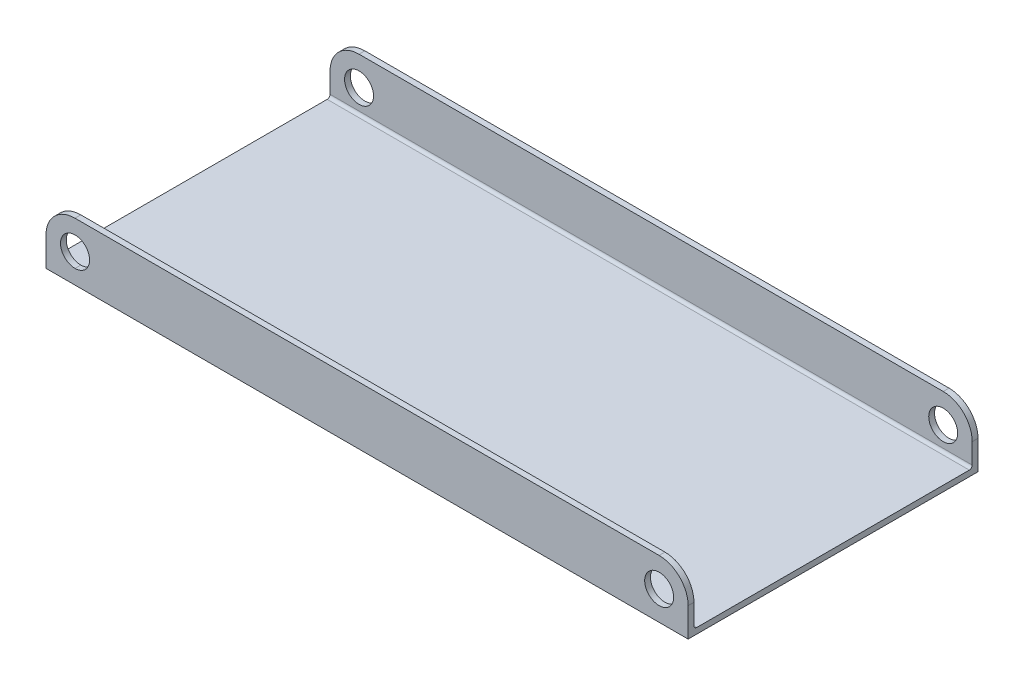
ISO-10303-21;
HEADER;
FILE_DESCRIPTION(('STEP AP214'),'2;1');
FILE_NAME('part.step','',(''),(''),'','','');
FILE_SCHEMA(('AUTOMOTIVE_DESIGN { 1 0 10303 214 1 1 1 1 }'));
ENDSEC;
DATA;
#1=APPLICATION_CONTEXT('core data for automotive mechanical design processes');
#2=APPLICATION_PROTOCOL_DEFINITION('international standard','automotive_design',2000,#1);
#3=PRODUCT_CONTEXT('',#1,'mechanical');
#4=PRODUCT('Part','Part','',(#3));
#5=PRODUCT_RELATED_PRODUCT_CATEGORY('part','',(#4));
#6=PRODUCT_DEFINITION_FORMATION('','',#4);
#7=PRODUCT_DEFINITION_CONTEXT('part definition',#1,'design');
#8=PRODUCT_DEFINITION('design','',#6,#7);
#9=PRODUCT_DEFINITION_SHAPE('','',#8);
#10=(LENGTH_UNIT() NAMED_UNIT(*) SI_UNIT(.MILLI.,.METRE.));
#11=(NAMED_UNIT(*) PLANE_ANGLE_UNIT() SI_UNIT($,.RADIAN.));
#12=(NAMED_UNIT(*) SI_UNIT($,.STERADIAN.) SOLID_ANGLE_UNIT());
#13=UNCERTAINTY_MEASURE_WITH_UNIT(LENGTH_MEASURE(1.E-05),#10,'distance_accuracy_value','');
#14=(GEOMETRIC_REPRESENTATION_CONTEXT(3) GLOBAL_UNCERTAINTY_ASSIGNED_CONTEXT((#13)) GLOBAL_UNIT_ASSIGNED_CONTEXT((#10,
#11,#12)) REPRESENTATION_CONTEXT('',''));
#15=CARTESIAN_POINT('',(0.,0.,0.));
#16=DIRECTION('',(0.,0.,1.));
#17=DIRECTION('',(1.,0.,0.));
#18=AXIS2_PLACEMENT_3D('',#15,#16,#17);
#19=CARTESIAN_POINT('',(0.,12.7,-1.27));
#20=DIRECTION('',(0.,0.,-1.));
#21=DIRECTION('',(-1.,0.,0.));
#22=AXIS2_PLACEMENT_3D('',#19,#20,#21);
#23=PLANE('',#22);
#24=CARTESIAN_POINT('',(6.35,6.35,-1.27));
#25=DIRECTION('',(0.,0.,-1.));
#26=DIRECTION('',(-1.,0.,0.));
#27=AXIS2_PLACEMENT_3D('',#24,#25,#26);
#28=CIRCLE('',#27,3.175);
#29=CARTESIAN_POINT('',(6.36182195991576,3.17502200932609,-1.27));
#30=VERTEX_POINT('',#29);
#31=CARTESIAN_POINT('',(6.36182195991576,9.52497799067391,-1.26999999999999));
#32=VERTEX_POINT('',#31);
#33=EDGE_CURVE('E58',#30,#32,#28,.T.);
#34=ORIENTED_EDGE('',*,*,#33,.F.);
#35=CARTESIAN_POINT('',(6.37364391983117,6.35,-1.26999999999999));
#36=DIRECTION('',(0.,0.,-1.));
#37=DIRECTION('',(-1.,0.,0.));
#38=AXIS2_PLACEMENT_3D('',#35,#36,#37);
#39=CIRCLE('',#38,3.175);
#40=EDGE_CURVE('E173',#32,#30,#39,.T.);
#41=ORIENTED_EDGE('',*,*,#40,.F.);
#42=EDGE_LOOP('',(#34,#41));
#43=FACE_BOUND('',#42,.T.);
#44=CARTESIAN_POINT('',(134.326923076923,6.34999999999998,-1.27));
#45=DIRECTION('',(0.,0.,-1.));
#46=DIRECTION('',(-1.,0.,0.));
#47=AXIS2_PLACEMENT_3D('',#44,#45,#46);
#48=CIRCLE('',#47,3.175);
#49=CARTESIAN_POINT('',(131.151923076923,6.34999999999998,-1.27));
#50=VERTEX_POINT('',#49);
#51=EDGE_CURVE('E162',#50,#50,#48,.T.);
#52=ORIENTED_EDGE('',*,*,#51,.F.);
#53=EDGE_LOOP('',(#52));
#54=FACE_BOUND('',#53,.T.);
#55=DIRECTION('',(0.,-1.,0.));
#56=VECTOR('',#55,1.);
#57=CARTESIAN_POINT('',(140.676923076923,12.7,-1.27));
#58=LINE('',#57,#56);
#59=CARTESIAN_POINT('',(140.676923076923,6.35,-1.27));
#60=VERTEX_POINT('',#59);
#61=CARTESIAN_POINT('',(140.676923076923,1.905,-1.27));
#62=VERTEX_POINT('',#61);
#63=EDGE_CURVE('E194',#60,#62,#58,.T.);
#64=ORIENTED_EDGE('',*,*,#63,.T.);
#65=DIRECTION('',(1.,0.,0.));
#66=VECTOR('',#65,1.);
#67=CARTESIAN_POINT('',(0.,1.905,-1.27));
#68=LINE('',#67,#66);
#69=CARTESIAN_POINT('',(0.,1.905,-1.27));
#70=VERTEX_POINT('',#69);
#71=EDGE_CURVE('E252',#62,#70,#68,.F.);
#72=ORIENTED_EDGE('',*,*,#71,.T.);
#73=DIRECTION('',(0.,-1.,0.));
#74=VECTOR('',#73,1.);
#75=CARTESIAN_POINT('',(0.,12.7,-1.27));
#76=LINE('',#75,#74);
#77=CARTESIAN_POINT('',(0.,6.35,-1.27));
#78=VERTEX_POINT('',#77);
#79=EDGE_CURVE('E208',#78,#70,#76,.T.);
#80=ORIENTED_EDGE('',*,*,#79,.F.);
#81=CARTESIAN_POINT('',(6.35,6.35,-1.27));
#82=DIRECTION('',(0.,0.,-1.));
#83=DIRECTION('',(-1.,0.,0.));
#84=AXIS2_PLACEMENT_3D('',#81,#82,#83);
#85=CIRCLE('',#84,6.35);
#86=CARTESIAN_POINT('',(6.35,12.7,-1.27));
#87=VERTEX_POINT('',#86);
#88=EDGE_CURVE('E219',#78,#87,#85,.T.);
#89=ORIENTED_EDGE('',*,*,#88,.T.);
#90=DIRECTION('',(1.,0.,0.));
#91=VECTOR('',#90,1.);
#92=CARTESIAN_POINT('',(0.,12.7,-1.27));
#93=LINE('',#92,#91);
#94=CARTESIAN_POINT('',(134.326923076923,12.7,-1.27));
#95=VERTEX_POINT('',#94);
#96=EDGE_CURVE('E187',#87,#95,#93,.T.);
#97=ORIENTED_EDGE('',*,*,#96,.T.);
#98=CARTESIAN_POINT('',(134.326923076923,6.35,-1.27));
#99=DIRECTION('',(0.,0.,-1.));
#100=DIRECTION('',(-1.,0.,0.));
#101=AXIS2_PLACEMENT_3D('',#98,#99,#100);
#102=CIRCLE('',#101,6.35);
#103=EDGE_CURVE('E217',#95,#60,#102,.T.);
#104=ORIENTED_EDGE('',*,*,#103,.T.);
#105=EDGE_LOOP('',(#64,#72,#80,#89,#97,#104));
#106=FACE_BOUND('',#105,.T.);
#107=ADVANCED_FACE('F43',(#43,#54,#106),#23,.T.);
#108=CARTESIAN_POINT('',(0.,12.7,0.));
#109=DIRECTION('',(-1.,0.,0.));
#110=DIRECTION('',(0.,0.,1.));
#111=AXIS2_PLACEMENT_3D('',#108,#109,#110);
#112=PLANE('',#111);
#113=DIRECTION('',(0.,-1.,0.));
#114=VECTOR('',#113,1.);
#115=CARTESIAN_POINT('',(0.,12.7,0.));
#116=LINE('',#115,#114);
#117=CARTESIAN_POINT('',(0.,6.35,0.));
#118=VERTEX_POINT('',#117);
#119=CARTESIAN_POINT('',(0.,0.,0.));
#120=VERTEX_POINT('',#119);
#121=EDGE_CURVE('E206',#118,#120,#116,.T.);
#122=ORIENTED_EDGE('',*,*,#121,.F.);
#123=DIRECTION('',(0.,0.,-1.));
#124=VECTOR('',#123,1.);
#125=CARTESIAN_POINT('',(0.,6.35,0.));
#126=LINE('',#125,#124);
#127=EDGE_CURVE('E214',#118,#78,#126,.T.);
#128=ORIENTED_EDGE('',*,*,#127,.T.);
#129=ORIENTED_EDGE('',*,*,#79,.T.);
#130=CARTESIAN_POINT('',(0.,1.905,-1.905));
#131=DIRECTION('',(-1.,0.,0.));
#132=DIRECTION('',(0.,0.,1.));
#133=AXIS2_PLACEMENT_3D('',#130,#131,#132);
#134=CIRCLE('',#133,0.635);
#135=CARTESIAN_POINT('',(0.,1.27,-1.905));
#136=VERTEX_POINT('',#135);
#137=EDGE_CURVE('E259',#70,#136,#134,.F.);
#138=ORIENTED_EDGE('',*,*,#137,.T.);
#139=DIRECTION('',(0.,0.,-1.));
#140=VECTOR('',#139,1.);
#141=CARTESIAN_POINT('',(0.,1.27,0.));
#142=LINE('',#141,#140);
#143=CARTESIAN_POINT('',(0.,1.27,-61.595));
#144=VERTEX_POINT('',#143);
#145=EDGE_CURVE('E176',#136,#144,#142,.T.);
#146=ORIENTED_EDGE('',*,*,#145,.T.);
#147=CARTESIAN_POINT('',(0.,1.905,-61.595));
#148=DIRECTION('',(-1.,0.,0.));
#149=DIRECTION('',(0.,0.,1.));
#150=AXIS2_PLACEMENT_3D('',#147,#148,#149);
#151=CIRCLE('',#150,0.635);
#152=CARTESIAN_POINT('',(0.,1.905,-62.23));
#153=VERTEX_POINT('',#152);
#154=EDGE_CURVE('E11',#144,#153,#151,.F.);
#155=ORIENTED_EDGE('',*,*,#154,.T.);
#156=DIRECTION('',(0.,-1.,0.));
#157=VECTOR('',#156,1.);
#158=CARTESIAN_POINT('',(0.,12.7,-62.23));
#159=LINE('',#158,#157);
#160=CARTESIAN_POINT('',(0.,6.35,-62.23));
#161=VERTEX_POINT('',#160);
#162=EDGE_CURVE('E174',#161,#153,#159,.T.);
#163=ORIENTED_EDGE('',*,*,#162,.F.);
#164=DIRECTION('',(0.,0.,-1.));
#165=VECTOR('',#164,1.);
#166=CARTESIAN_POINT('',(0.,6.35,0.));
#167=LINE('',#166,#165);
#168=CARTESIAN_POINT('',(0.,6.35,-63.5));
#169=VERTEX_POINT('',#168);
#170=EDGE_CURVE('E211',#161,#169,#167,.T.);
#171=ORIENTED_EDGE('',*,*,#170,.T.);
#172=DIRECTION('',(0.,-1.,0.));
#173=VECTOR('',#172,1.);
#174=CARTESIAN_POINT('',(0.,12.7,-63.5));
#175=LINE('',#174,#173);
#176=CARTESIAN_POINT('',(0.,0.,-63.5));
#177=VERTEX_POINT('',#176);
#178=EDGE_CURVE('E291',#169,#177,#175,.T.);
#179=ORIENTED_EDGE('',*,*,#178,.T.);
#180=DIRECTION('',(0.,0.,-1.));
#181=VECTOR('',#180,1.);
#182=CARTESIAN_POINT('',(0.,0.,0.));
#183=LINE('',#182,#181);
#184=EDGE_CURVE('E186',#120,#177,#183,.T.);
#185=ORIENTED_EDGE('',*,*,#184,.F.);
#186=EDGE_LOOP('',(#122,#128,#129,#138,#146,#155,#163,#171,#179,#185));
#187=FACE_BOUND('',#186,.T.);
#188=ADVANCED_FACE('F280',(#187),#112,.T.);
#189=CARTESIAN_POINT('',(0.,12.7,0.));
#190=DIRECTION('',(0.,0.,-1.));
#191=DIRECTION('',(-1.,0.,0.));
#192=AXIS2_PLACEMENT_3D('',#189,#190,#191);
#193=PLANE('',#192);
#194=CARTESIAN_POINT('',(134.326923076923,6.34999999999998,0.));
#195=DIRECTION('',(0.,0.,-1.));
#196=DIRECTION('',(-1.,0.,0.));
#197=AXIS2_PLACEMENT_3D('',#194,#195,#196);
#198=CIRCLE('',#197,3.175);
#199=CARTESIAN_POINT('',(131.151923076923,6.34999999999998,0.));
#200=VERTEX_POINT('',#199);
#201=EDGE_CURVE('E169',#200,#200,#198,.T.);
#202=ORIENTED_EDGE('',*,*,#201,.T.);
#203=EDGE_LOOP('',(#202));
#204=FACE_BOUND('',#203,.T.);
#205=CARTESIAN_POINT('',(6.37364391983117,6.35,0.));
#206=DIRECTION('',(0.,0.,1.));
#207=DIRECTION('',(1.,0.,0.));
#208=AXIS2_PLACEMENT_3D('',#205,#206,#207);
#209=CIRCLE('',#208,3.175);
#210=CARTESIAN_POINT('',(6.36182195991576,3.17502200932609,0.));
#211=VERTEX_POINT('',#210);
#212=CARTESIAN_POINT('',(6.36182195991576,9.52497799067391,0.));
#213=VERTEX_POINT('',#212);
#214=EDGE_CURVE('E168',#211,#213,#209,.T.);
#215=ORIENTED_EDGE('',*,*,#214,.F.);
#216=CARTESIAN_POINT('',(6.35,6.35,0.));
#217=DIRECTION('',(0.,0.,-1.));
#218=DIRECTION('',(-1.,0.,0.));
#219=AXIS2_PLACEMENT_3D('',#216,#217,#218);
#220=CIRCLE('',#219,3.175);
#221=EDGE_CURVE('E156',#211,#213,#220,.T.);
#222=ORIENTED_EDGE('',*,*,#221,.T.);
#223=EDGE_LOOP('',(#215,#222));
#224=FACE_BOUND('',#223,.T.);
#225=DIRECTION('',(1.,0.,0.));
#226=VECTOR('',#225,1.);
#227=CARTESIAN_POINT('',(0.,12.7,0.));
#228=LINE('',#227,#226);
#229=CARTESIAN_POINT('',(6.35,12.7,0.));
#230=VERTEX_POINT('',#229);
#231=CARTESIAN_POINT('',(134.326923076923,12.7,0.));
#232=VERTEX_POINT('',#231);
#233=EDGE_CURVE('E190',#230,#232,#228,.T.);
#234=ORIENTED_EDGE('',*,*,#233,.F.);
#235=CARTESIAN_POINT('',(6.35,6.35,0.));
#236=DIRECTION('',(0.,0.,-1.));
#237=DIRECTION('',(-1.,0.,0.));
#238=AXIS2_PLACEMENT_3D('',#235,#236,#237);
#239=CIRCLE('',#238,6.35);
#240=EDGE_CURVE('E228',#230,#118,#239,.F.);
#241=ORIENTED_EDGE('',*,*,#240,.T.);
#242=ORIENTED_EDGE('',*,*,#121,.T.);
#243=DIRECTION('',(1.,0.,0.));
#244=VECTOR('',#243,1.);
#245=CARTESIAN_POINT('',(0.,0.,0.));
#246=LINE('',#245,#244);
#247=CARTESIAN_POINT('',(140.676923076923,0.,0.));
#248=VERTEX_POINT('',#247);
#249=EDGE_CURVE('E197',#120,#248,#246,.T.);
#250=ORIENTED_EDGE('',*,*,#249,.T.);
#251=DIRECTION('',(0.,-1.,0.));
#252=VECTOR('',#251,1.);
#253=CARTESIAN_POINT('',(140.676923076923,12.7,0.));
#254=LINE('',#253,#252);
#255=CARTESIAN_POINT('',(140.676923076923,6.35,0.));
#256=VERTEX_POINT('',#255);
#257=EDGE_CURVE('E204',#256,#248,#254,.T.);
#258=ORIENTED_EDGE('',*,*,#257,.F.);
#259=CARTESIAN_POINT('',(134.326923076923,6.35,0.));
#260=DIRECTION('',(0.,0.,-1.));
#261=DIRECTION('',(-1.,0.,0.));
#262=AXIS2_PLACEMENT_3D('',#259,#260,#261);
#263=CIRCLE('',#262,6.35);
#264=EDGE_CURVE('E226',#256,#232,#263,.F.);
#265=ORIENTED_EDGE('',*,*,#264,.T.);
#266=EDGE_LOOP('',(#234,#241,#242,#250,#258,#265));
#267=FACE_BOUND('',#266,.T.);
#268=ADVANCED_FACE('F166',(#204,#224,#267),#193,.F.);
#269=CARTESIAN_POINT('',(140.676923076923,12.7,0.));
#270=DIRECTION('',(-1.,0.,0.));
#271=DIRECTION('',(0.,0.,1.));
#272=AXIS2_PLACEMENT_3D('',#269,#270,#271);
#273=PLANE('',#272);
#274=ORIENTED_EDGE('',*,*,#63,.F.);
#275=DIRECTION('',(0.,0.,-1.));
#276=VECTOR('',#275,1.);
#277=CARTESIAN_POINT('',(140.676923076923,6.35,0.));
#278=LINE('',#277,#276);
#279=EDGE_CURVE('E232',#60,#256,#278,.F.);
#280=ORIENTED_EDGE('',*,*,#279,.T.);
#281=ORIENTED_EDGE('',*,*,#257,.T.);
#282=DIRECTION('',(0.,0.,-1.));
#283=VECTOR('',#282,1.);
#284=CARTESIAN_POINT('',(140.676923076923,0.,0.));
#285=LINE('',#284,#283);
#286=CARTESIAN_POINT('',(140.676923076923,0.,-63.5));
#287=VERTEX_POINT('',#286);
#288=EDGE_CURVE('E191',#248,#287,#285,.T.);
#289=ORIENTED_EDGE('',*,*,#288,.T.);
#290=DIRECTION('',(0.,-1.,0.));
#291=VECTOR('',#290,1.);
#292=CARTESIAN_POINT('',(140.676923076923,12.7,-63.5));
#293=LINE('',#292,#291);
#294=CARTESIAN_POINT('',(140.676923076923,6.35,-63.5));
#295=VERTEX_POINT('',#294);
#296=EDGE_CURVE('E298',#295,#287,#293,.T.);
#297=ORIENTED_EDGE('',*,*,#296,.F.);
#298=DIRECTION('',(0.,0.,-1.));
#299=VECTOR('',#298,1.);
#300=CARTESIAN_POINT('',(140.676923076923,6.35,-62.23));
#301=LINE('',#300,#299);
#302=CARTESIAN_POINT('',(140.676923076923,6.35,-62.23));
#303=VERTEX_POINT('',#302);
#304=EDGE_CURVE('E230',#295,#303,#301,.F.);
#305=ORIENTED_EDGE('',*,*,#304,.T.);
#306=DIRECTION('',(0.,-1.,0.));
#307=VECTOR('',#306,1.);
#308=CARTESIAN_POINT('',(140.676923076923,12.7,-62.23));
#309=LINE('',#308,#307);
#310=CARTESIAN_POINT('',(140.676923076923,1.905,-62.23));
#311=VERTEX_POINT('',#310);
#312=EDGE_CURVE('E178',#303,#311,#309,.T.);
#313=ORIENTED_EDGE('',*,*,#312,.T.);
#314=CARTESIAN_POINT('',(140.676923076923,1.905,-61.595));
#315=DIRECTION('',(-1.,0.,0.));
#316=DIRECTION('',(0.,0.,1.));
#317=AXIS2_PLACEMENT_3D('',#314,#315,#316);
#318=CIRCLE('',#317,0.635);
#319=CARTESIAN_POINT('',(140.676923076923,1.27,-61.595));
#320=VERTEX_POINT('',#319);
#321=EDGE_CURVE('E51',#311,#320,#318,.T.);
#322=ORIENTED_EDGE('',*,*,#321,.T.);
#323=DIRECTION('',(0.,0.,-1.));
#324=VECTOR('',#323,1.);
#325=CARTESIAN_POINT('',(140.676923076923,1.27,0.));
#326=LINE('',#325,#324);
#327=CARTESIAN_POINT('',(140.676923076923,1.27,-1.905));
#328=VERTEX_POINT('',#327);
#329=EDGE_CURVE('E183',#328,#320,#326,.T.);
#330=ORIENTED_EDGE('',*,*,#329,.F.);
#331=CARTESIAN_POINT('',(140.676923076923,1.905,-1.905));
#332=DIRECTION('',(-1.,0.,0.));
#333=DIRECTION('',(0.,0.,1.));
#334=AXIS2_PLACEMENT_3D('',#331,#332,#333);
#335=CIRCLE('',#334,0.635);
#336=EDGE_CURVE('E257',#328,#62,#335,.T.);
#337=ORIENTED_EDGE('',*,*,#336,.T.);
#338=EDGE_LOOP('',(#274,#280,#281,#289,#297,#305,#313,#322,#330,#337));
#339=FACE_BOUND('',#338,.T.);
#340=ADVANCED_FACE('F264',(#339),#273,.F.);
#341=CARTESIAN_POINT('',(0.,12.7,0.));
#342=DIRECTION('',(0.,1.,0.));
#343=DIRECTION('',(0.,0.,1.));
#344=AXIS2_PLACEMENT_3D('',#341,#342,#343);
#345=PLANE('',#344);
#346=ORIENTED_EDGE('',*,*,#96,.F.);
#347=DIRECTION('',(0.,0.,-1.));
#348=VECTOR('',#347,1.);
#349=CARTESIAN_POINT('',(6.35,12.7,0.));
#350=LINE('',#349,#348);
#351=EDGE_CURVE('E224',#87,#230,#350,.F.);
#352=ORIENTED_EDGE('',*,*,#351,.T.);
#353=ORIENTED_EDGE('',*,*,#233,.T.);
#354=DIRECTION('',(0.,0.,-1.));
#355=VECTOR('',#354,1.);
#356=CARTESIAN_POINT('',(134.326923076923,12.7,-1.27));
#357=LINE('',#356,#355);
#358=EDGE_CURVE('E221',#232,#95,#357,.T.);
#359=ORIENTED_EDGE('',*,*,#358,.T.);
#360=EDGE_LOOP('',(#346,#352,#353,#359));
#361=FACE_BOUND('',#360,.T.);
#362=ADVANCED_FACE('F324',(#361),#345,.T.);
#363=CARTESIAN_POINT('',(0.,0.,0.));
#364=DIRECTION('',(0.,1.,0.));
#365=DIRECTION('',(0.,0.,1.));
#366=AXIS2_PLACEMENT_3D('',#363,#364,#365);
#367=PLANE('',#366);
#368=ORIENTED_EDGE('',*,*,#184,.T.);
#369=DIRECTION('',(1.,0.,0.));
#370=VECTOR('',#369,1.);
#371=CARTESIAN_POINT('',(0.,0.,-63.5));
#372=LINE('',#371,#370);
#373=EDGE_CURVE('E300',#177,#287,#372,.T.);
#374=ORIENTED_EDGE('',*,*,#373,.T.);
#375=ORIENTED_EDGE('',*,*,#288,.F.);
#376=ORIENTED_EDGE('',*,*,#249,.F.);
#377=EDGE_LOOP('',(#368,#374,#375,#376));
#378=FACE_BOUND('',#377,.T.);
#379=ADVANCED_FACE('F313',(#378),#367,.F.);
#380=CARTESIAN_POINT('',(0.,1.27,0.));
#381=DIRECTION('',(0.,1.,0.));
#382=DIRECTION('',(0.,0.,1.));
#383=AXIS2_PLACEMENT_3D('',#380,#381,#382);
#384=PLANE('',#383);
#385=ORIENTED_EDGE('',*,*,#145,.F.);
#386=DIRECTION('',(1.,0.,0.));
#387=VECTOR('',#386,1.);
#388=CARTESIAN_POINT('',(140.676923076923,1.27,-1.905));
#389=LINE('',#388,#387);
#390=EDGE_CURVE('E249',#136,#328,#389,.T.);
#391=ORIENTED_EDGE('',*,*,#390,.T.);
#392=ORIENTED_EDGE('',*,*,#329,.T.);
#393=DIRECTION('',(1.,0.,0.));
#394=VECTOR('',#393,1.);
#395=CARTESIAN_POINT('',(0.,1.27,-61.595));
#396=LINE('',#395,#394);
#397=EDGE_CURVE('E247',#320,#144,#396,.F.);
#398=ORIENTED_EDGE('',*,*,#397,.T.);
#399=EDGE_LOOP('',(#385,#391,#392,#398));
#400=FACE_BOUND('',#399,.T.);
#401=ADVANCED_FACE('F271',(#400),#384,.T.);
#402=CARTESIAN_POINT('',(6.37364391983117,6.35,-508.));
#403=DIRECTION('',(0.,0.,1.));
#404=DIRECTION('',(1.,0.,0.));
#405=AXIS2_PLACEMENT_3D('',#402,#403,#404);
#406=CYLINDRICAL_SURFACE('',#405,3.175);
#407=ORIENTED_EDGE('',*,*,#40,.T.);
#408=DIRECTION('',(0.,0.,-1.));
#409=VECTOR('',#408,1.);
#410=CARTESIAN_POINT('',(6.36182195991576,3.17502200932609,-31.75));
#411=LINE('',#410,#409);
#412=EDGE_CURVE('E172',#30,#211,#411,.F.);
#413=ORIENTED_EDGE('',*,*,#412,.T.);
#414=ORIENTED_EDGE('',*,*,#214,.T.);
#415=DIRECTION('',(0.,0.,-1.));
#416=VECTOR('',#415,1.);
#417=CARTESIAN_POINT('',(6.36182195991576,9.52497799067391,-31.75));
#418=LINE('',#417,#416);
#419=EDGE_CURVE('E153',#213,#32,#418,.T.);
#420=ORIENTED_EDGE('',*,*,#419,.T.);
#421=EDGE_LOOP('',(#407,#413,#414,#420));
#422=FACE_BOUND('',#421,.T.);
#423=ADVANCED_FACE('F171',(#422),#406,.F.);
#424=CARTESIAN_POINT('',(0.,12.7,-62.23));
#425=DIRECTION('',(0.,0.,-1.));
#426=DIRECTION('',(-1.,0.,0.));
#427=AXIS2_PLACEMENT_3D('',#424,#425,#426);
#428=PLANE('',#427);
#429=CARTESIAN_POINT('',(6.35,6.35,-62.23));
#430=DIRECTION('',(0.,0.,-1.));
#431=DIRECTION('',(-1.,0.,0.));
#432=AXIS2_PLACEMENT_3D('',#429,#430,#431);
#433=CIRCLE('',#432,3.175);
#434=CARTESIAN_POINT('',(3.175,6.35,-62.23));
#435=VERTEX_POINT('',#434);
#436=EDGE_CURVE('E305',#435,#435,#433,.T.);
#437=ORIENTED_EDGE('',*,*,#436,.T.);
#438=EDGE_LOOP('',(#437));
#439=FACE_BOUND('',#438,.T.);
#440=CARTESIAN_POINT('',(134.326923076923,6.34999999999998,-62.23));
#441=DIRECTION('',(0.,0.,-1.));
#442=DIRECTION('',(-1.,0.,0.));
#443=AXIS2_PLACEMENT_3D('',#440,#441,#442);
#444=CIRCLE('',#443,3.175);
#445=CARTESIAN_POINT('',(131.151923076923,6.34999999999998,-62.23));
#446=VERTEX_POINT('',#445);
#447=EDGE_CURVE('E547',#446,#446,#444,.T.);
#448=ORIENTED_EDGE('',*,*,#447,.T.);
#449=EDGE_LOOP('',(#448));
#450=FACE_BOUND('',#449,.T.);
#451=ORIENTED_EDGE('',*,*,#162,.T.);
#452=DIRECTION('',(1.,0.,0.));
#453=VECTOR('',#452,1.);
#454=CARTESIAN_POINT('',(0.,1.905,-62.23));
#455=LINE('',#454,#453);
#456=EDGE_CURVE('E254',#153,#311,#455,.T.);
#457=ORIENTED_EDGE('',*,*,#456,.T.);
#458=ORIENTED_EDGE('',*,*,#312,.F.);
#459=CARTESIAN_POINT('',(134.326923076923,6.35,-62.23));
#460=DIRECTION('',(0.,0.,-1.));
#461=DIRECTION('',(-1.,0.,0.));
#462=AXIS2_PLACEMENT_3D('',#459,#460,#461);
#463=CIRCLE('',#462,6.35);
#464=CARTESIAN_POINT('',(134.326923076923,12.7,-62.23));
#465=VERTEX_POINT('',#464);
#466=EDGE_CURVE('E245',#303,#465,#463,.F.);
#467=ORIENTED_EDGE('',*,*,#466,.T.);
#468=DIRECTION('',(1.,0.,0.));
#469=VECTOR('',#468,1.);
#470=CARTESIAN_POINT('',(0.,12.7,-62.23));
#471=LINE('',#470,#469);
#472=CARTESIAN_POINT('',(6.35,12.7,-62.23));
#473=VERTEX_POINT('',#472);
#474=EDGE_CURVE('E296',#473,#465,#471,.T.);
#475=ORIENTED_EDGE('',*,*,#474,.F.);
#476=CARTESIAN_POINT('',(6.35,6.35,-62.23));
#477=DIRECTION('',(0.,0.,-1.));
#478=DIRECTION('',(-1.,0.,0.));
#479=AXIS2_PLACEMENT_3D('',#476,#477,#478);
#480=CIRCLE('',#479,6.35);
#481=EDGE_CURVE('E243',#473,#161,#480,.F.);
#482=ORIENTED_EDGE('',*,*,#481,.T.);
#483=EDGE_LOOP('',(#451,#457,#458,#467,#475,#482));
#484=FACE_BOUND('',#483,.T.);
#485=ADVANCED_FACE('F274',(#439,#450,#484),#428,.F.);
#486=CARTESIAN_POINT('',(0.,12.7,-63.5));
#487=DIRECTION('',(0.,0.,-1.));
#488=DIRECTION('',(-1.,0.,0.));
#489=AXIS2_PLACEMENT_3D('',#486,#487,#488);
#490=PLANE('',#489);
#491=CARTESIAN_POINT('',(6.35,6.35,-63.5));
#492=DIRECTION('',(0.,0.,-1.));
#493=DIRECTION('',(-1.,0.,0.));
#494=AXIS2_PLACEMENT_3D('',#491,#492,#493);
#495=CIRCLE('',#494,3.175);
#496=CARTESIAN_POINT('',(3.175,6.35,-63.5));
#497=VERTEX_POINT('',#496);
#498=EDGE_CURVE('E544',#497,#497,#495,.T.);
#499=ORIENTED_EDGE('',*,*,#498,.F.);
#500=EDGE_LOOP('',(#499));
#501=FACE_BOUND('',#500,.T.);
#502=CARTESIAN_POINT('',(134.326923076923,6.34999999999998,-63.5));
#503=DIRECTION('',(0.,0.,-1.));
#504=DIRECTION('',(-1.,0.,0.));
#505=AXIS2_PLACEMENT_3D('',#502,#503,#504);
#506=CIRCLE('',#505,3.175);
#507=CARTESIAN_POINT('',(131.151923076923,6.34999999999998,-63.5));
#508=VERTEX_POINT('',#507);
#509=EDGE_CURVE('E543',#508,#508,#506,.T.);
#510=ORIENTED_EDGE('',*,*,#509,.F.);
#511=EDGE_LOOP('',(#510));
#512=FACE_BOUND('',#511,.T.);
#513=DIRECTION('',(1.,0.,0.));
#514=VECTOR('',#513,1.);
#515=CARTESIAN_POINT('',(0.,12.7,-63.5));
#516=LINE('',#515,#514);
#517=CARTESIAN_POINT('',(6.35,12.7,-63.5));
#518=VERTEX_POINT('',#517);
#519=CARTESIAN_POINT('',(134.326923076923,12.7,-63.5));
#520=VERTEX_POINT('',#519);
#521=EDGE_CURVE('E289',#518,#520,#516,.T.);
#522=ORIENTED_EDGE('',*,*,#521,.T.);
#523=CARTESIAN_POINT('',(134.326923076923,6.35,-63.5));
#524=DIRECTION('',(0.,0.,-1.));
#525=DIRECTION('',(-1.,0.,0.));
#526=AXIS2_PLACEMENT_3D('',#523,#524,#525);
#527=CIRCLE('',#526,6.35);
#528=EDGE_CURVE('E241',#520,#295,#527,.T.);
#529=ORIENTED_EDGE('',*,*,#528,.T.);
#530=ORIENTED_EDGE('',*,*,#296,.T.);
#531=ORIENTED_EDGE('',*,*,#373,.F.);
#532=ORIENTED_EDGE('',*,*,#178,.F.);
#533=CARTESIAN_POINT('',(6.35,6.35,-63.5));
#534=DIRECTION('',(0.,0.,-1.));
#535=DIRECTION('',(-1.,0.,0.));
#536=AXIS2_PLACEMENT_3D('',#533,#534,#535);
#537=CIRCLE('',#536,6.35);
#538=EDGE_CURVE('E239',#169,#518,#537,.T.);
#539=ORIENTED_EDGE('',*,*,#538,.T.);
#540=EDGE_LOOP('',(#522,#529,#530,#531,#532,#539));
#541=FACE_BOUND('',#540,.T.);
#542=ADVANCED_FACE('F288',(#501,#512,#541),#490,.T.);
#543=CARTESIAN_POINT('',(0.,12.7,0.));
#544=DIRECTION('',(0.,1.,0.));
#545=DIRECTION('',(0.,0.,1.));
#546=AXIS2_PLACEMENT_3D('',#543,#544,#545);
#547=PLANE('',#546);
#548=ORIENTED_EDGE('',*,*,#474,.T.);
#549=DIRECTION('',(0.,0.,-1.));
#550=VECTOR('',#549,1.);
#551=CARTESIAN_POINT('',(134.326923076923,12.7,-63.5));
#552=LINE('',#551,#550);
#553=EDGE_CURVE('E236',#465,#520,#552,.T.);
#554=ORIENTED_EDGE('',*,*,#553,.T.);
#555=ORIENTED_EDGE('',*,*,#521,.F.);
#556=DIRECTION('',(0.,0.,-1.));
#557=VECTOR('',#556,1.);
#558=CARTESIAN_POINT('',(6.35,12.7,0.));
#559=LINE('',#558,#557);
#560=EDGE_CURVE('E234',#518,#473,#559,.F.);
#561=ORIENTED_EDGE('',*,*,#560,.T.);
#562=EDGE_LOOP('',(#548,#554,#555,#561));
#563=FACE_BOUND('',#562,.T.);
#564=ADVANCED_FACE('F294',(#563),#547,.T.);
#565=CARTESIAN_POINT('',(134.326923076923,6.34999999999998,-50.8));
#566=DIRECTION('',(0.,0.,-1.));
#567=DIRECTION('',(-1.,0.,0.));
#568=AXIS2_PLACEMENT_3D('',#565,#566,#567);
#569=CYLINDRICAL_SURFACE('',#568,3.175);
#570=ORIENTED_EDGE('',*,*,#509,.T.);
#571=EDGE_LOOP('',(#570));
#572=FACE_BOUND('',#571,.T.);
#573=ORIENTED_EDGE('',*,*,#447,.F.);
#574=EDGE_LOOP('',(#573));
#575=FACE_BOUND('',#574,.T.);
#576=ADVANCED_FACE('F426',(#572,#575),#569,.F.);
#577=CARTESIAN_POINT('',(6.35,6.35,-50.8));
#578=DIRECTION('',(0.,0.,-1.));
#579=DIRECTION('',(-1.,0.,0.));
#580=AXIS2_PLACEMENT_3D('',#577,#578,#579);
#581=CYLINDRICAL_SURFACE('',#580,3.175);
#582=ORIENTED_EDGE('',*,*,#498,.T.);
#583=EDGE_LOOP('',(#582));
#584=FACE_BOUND('',#583,.T.);
#585=ORIENTED_EDGE('',*,*,#436,.F.);
#586=EDGE_LOOP('',(#585));
#587=FACE_BOUND('',#586,.T.);
#588=ADVANCED_FACE('F356',(#584,#587),#581,.F.);
#589=CARTESIAN_POINT('',(6.35,6.35,0.));
#590=DIRECTION('',(0.,0.,-1.));
#591=DIRECTION('',(-1.,0.,0.));
#592=AXIS2_PLACEMENT_3D('',#589,#590,#591);
#593=CYLINDRICAL_SURFACE('',#592,6.35);
#594=ORIENTED_EDGE('',*,*,#240,.F.);
#595=ORIENTED_EDGE('',*,*,#351,.F.);
#596=ORIENTED_EDGE('',*,*,#88,.F.);
#597=ORIENTED_EDGE('',*,*,#127,.F.);
#598=EDGE_LOOP('',(#594,#595,#596,#597));
#599=FACE_BOUND('',#598,.T.);
#600=ADVANCED_FACE('F319',(#599),#593,.T.);
#601=CARTESIAN_POINT('',(134.326923076923,6.35,0.));
#602=DIRECTION('',(0.,0.,1.));
#603=DIRECTION('',(1.,0.,0.));
#604=AXIS2_PLACEMENT_3D('',#601,#602,#603);
#605=CYLINDRICAL_SURFACE('',#604,6.35);
#606=ORIENTED_EDGE('',*,*,#264,.F.);
#607=ORIENTED_EDGE('',*,*,#279,.F.);
#608=ORIENTED_EDGE('',*,*,#103,.F.);
#609=ORIENTED_EDGE('',*,*,#358,.F.);
#610=EDGE_LOOP('',(#606,#607,#608,#609));
#611=FACE_BOUND('',#610,.T.);
#612=ADVANCED_FACE('F329',(#611),#605,.T.);
#613=CARTESIAN_POINT('',(134.326923076923,6.35,0.));
#614=DIRECTION('',(0.,0.,1.));
#615=DIRECTION('',(1.,0.,0.));
#616=AXIS2_PLACEMENT_3D('',#613,#614,#615);
#617=CYLINDRICAL_SURFACE('',#616,6.35);
#618=ORIENTED_EDGE('',*,*,#466,.F.);
#619=ORIENTED_EDGE('',*,*,#304,.F.);
#620=ORIENTED_EDGE('',*,*,#528,.F.);
#621=ORIENTED_EDGE('',*,*,#553,.F.);
#622=EDGE_LOOP('',(#618,#619,#620,#621));
#623=FACE_BOUND('',#622,.T.);
#624=ADVANCED_FACE('F341',(#623),#617,.T.);
#625=CARTESIAN_POINT('',(6.35,6.35,0.));
#626=DIRECTION('',(0.,0.,-1.));
#627=DIRECTION('',(-1.,0.,0.));
#628=AXIS2_PLACEMENT_3D('',#625,#626,#627);
#629=CYLINDRICAL_SURFACE('',#628,6.35);
#630=ORIENTED_EDGE('',*,*,#481,.F.);
#631=ORIENTED_EDGE('',*,*,#560,.F.);
#632=ORIENTED_EDGE('',*,*,#538,.F.);
#633=ORIENTED_EDGE('',*,*,#170,.F.);
#634=EDGE_LOOP('',(#630,#631,#632,#633));
#635=FACE_BOUND('',#634,.T.);
#636=ADVANCED_FACE('F283',(#635),#629,.T.);
#637=CARTESIAN_POINT('',(0.,1.905,-1.905));
#638=DIRECTION('',(-1.,0.,0.));
#639=DIRECTION('',(0.,0.,1.));
#640=AXIS2_PLACEMENT_3D('',#637,#638,#639);
#641=CYLINDRICAL_SURFACE('',#640,0.635);
#642=ORIENTED_EDGE('',*,*,#137,.F.);
#643=ORIENTED_EDGE('',*,*,#71,.F.);
#644=ORIENTED_EDGE('',*,*,#336,.F.);
#645=ORIENTED_EDGE('',*,*,#390,.F.);
#646=EDGE_LOOP('',(#642,#643,#644,#645));
#647=FACE_BOUND('',#646,.T.);
#648=ADVANCED_FACE('F334',(#647),#641,.F.);
#649=CARTESIAN_POINT('',(0.,1.905,-61.595));
#650=DIRECTION('',(1.,0.,0.));
#651=DIRECTION('',(0.,0.,-1.));
#652=AXIS2_PLACEMENT_3D('',#649,#650,#651);
#653=CYLINDRICAL_SURFACE('',#652,0.635);
#654=ORIENTED_EDGE('',*,*,#154,.F.);
#655=ORIENTED_EDGE('',*,*,#397,.F.);
#656=ORIENTED_EDGE('',*,*,#321,.F.);
#657=ORIENTED_EDGE('',*,*,#456,.F.);
#658=EDGE_LOOP('',(#654,#655,#656,#657));
#659=FACE_BOUND('',#658,.T.);
#660=ADVANCED_FACE('F45',(#659),#653,.F.);
#661=CARTESIAN_POINT('',(6.35,6.35,0.));
#662=DIRECTION('',(0.,0.,-1.));
#663=DIRECTION('',(-1.,0.,0.));
#664=AXIS2_PLACEMENT_3D('',#661,#662,#663);
#665=CYLINDRICAL_SURFACE('',#664,3.175);
#666=ORIENTED_EDGE('',*,*,#33,.T.);
#667=ORIENTED_EDGE('',*,*,#419,.F.);
#668=ORIENTED_EDGE('',*,*,#221,.F.);
#669=ORIENTED_EDGE('',*,*,#412,.F.);
#670=EDGE_LOOP('',(#666,#667,#668,#669));
#671=FACE_BOUND('',#670,.T.);
#672=ADVANCED_FACE('F155',(#671),#665,.F.);
#673=CARTESIAN_POINT('',(134.326923076923,6.34999999999998,0.));
#674=DIRECTION('',(0.,0.,-1.));
#675=DIRECTION('',(-1.,0.,0.));
#676=AXIS2_PLACEMENT_3D('',#673,#674,#675);
#677=CYLINDRICAL_SURFACE('',#676,3.175);
#678=ORIENTED_EDGE('',*,*,#51,.T.);
#679=EDGE_LOOP('',(#678));
#680=FACE_BOUND('',#679,.T.);
#681=ORIENTED_EDGE('',*,*,#201,.F.);
#682=EDGE_LOOP('',(#681));
#683=FACE_BOUND('',#682,.T.);
#684=ADVANCED_FACE('F473',(#680,#683),#677,.F.);
#685=CLOSED_SHELL('',(#107,#188,#268,#340,#362,#379,#401,#423,#485,#542,#564,#576,#588,#600,
#612,#624,#636,#648,#660,#672,#684));
#686=MANIFOLD_SOLID_BREP('B2',#685);
#687=ADVANCED_BREP_SHAPE_REPRESENTATION('',(#18,#686),#14);
#688=SHAPE_DEFINITION_REPRESENTATION(#9,#687);
ENDSEC;
END-ISO-10303-21;
